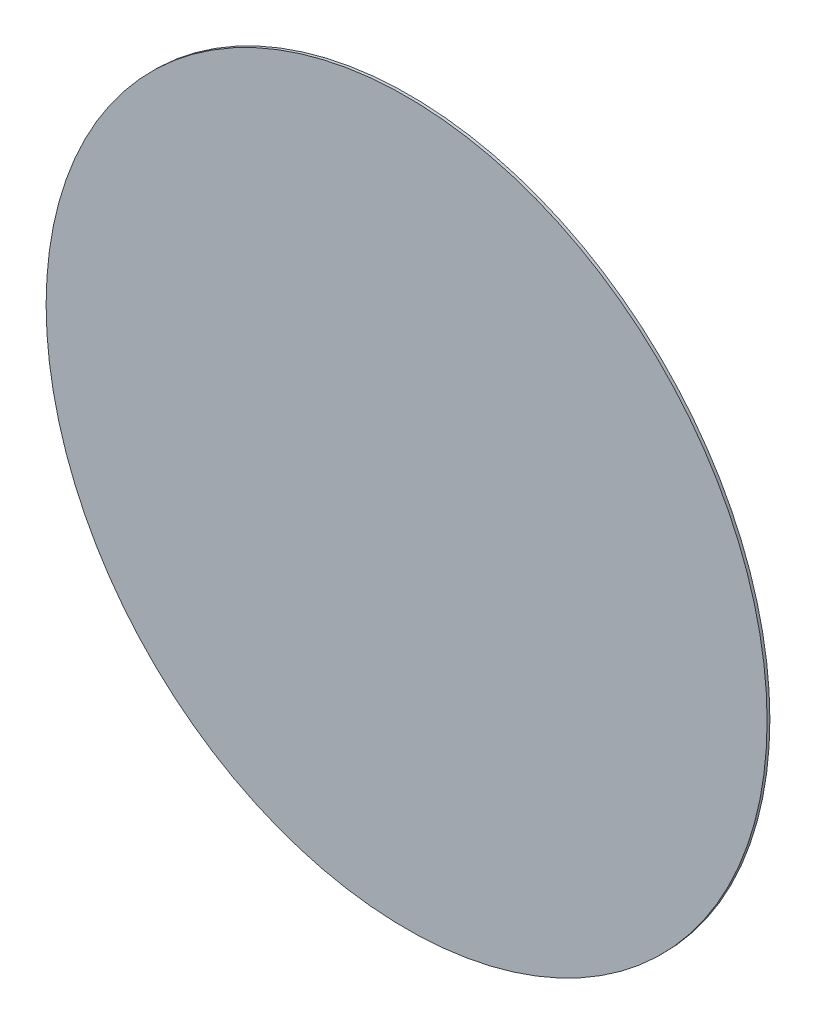
ISO-10303-21;
HEADER;
FILE_DESCRIPTION(('STEP AP214'),'2;1');
FILE_NAME('part.step','',(''),(''),'','','');
FILE_SCHEMA(('AUTOMOTIVE_DESIGN { 1 0 10303 214 1 1 1 1 }'));
ENDSEC;
DATA;
#1=APPLICATION_CONTEXT('core data for automotive mechanical design processes');
#2=APPLICATION_PROTOCOL_DEFINITION('international standard','automotive_design',2000,#1);
#3=PRODUCT_CONTEXT('',#1,'mechanical');
#4=PRODUCT('Part','Part','',(#3));
#5=PRODUCT_RELATED_PRODUCT_CATEGORY('part','',(#4));
#6=PRODUCT_DEFINITION_FORMATION('','',#4);
#7=PRODUCT_DEFINITION_CONTEXT('part definition',#1,'design');
#8=PRODUCT_DEFINITION('design','',#6,#7);
#9=PRODUCT_DEFINITION_SHAPE('','',#8);
#10=(LENGTH_UNIT() NAMED_UNIT(*) SI_UNIT(.MILLI.,.METRE.));
#11=(NAMED_UNIT(*) PLANE_ANGLE_UNIT() SI_UNIT($,.RADIAN.));
#12=(NAMED_UNIT(*) SI_UNIT($,.STERADIAN.) SOLID_ANGLE_UNIT());
#13=UNCERTAINTY_MEASURE_WITH_UNIT(LENGTH_MEASURE(1.E-05),#10,'distance_accuracy_value','');
#14=(GEOMETRIC_REPRESENTATION_CONTEXT(3) GLOBAL_UNCERTAINTY_ASSIGNED_CONTEXT((#13)) GLOBAL_UNIT_ASSIGNED_CONTEXT((#10,
#11,#12)) REPRESENTATION_CONTEXT('',''));
#15=CARTESIAN_POINT('',(0.,0.,0.));
#16=DIRECTION('',(0.,0.,1.));
#17=DIRECTION('',(1.,0.,0.));
#18=AXIS2_PLACEMENT_3D('',#15,#16,#17);
#19=CARTESIAN_POINT('',(0.,0.,0.1));
#20=DIRECTION('',(0.,0.,-1.));
#21=DIRECTION('',(-1.,0.,0.));
#22=AXIS2_PLACEMENT_3D('',#19,#20,#21);
#23=CYLINDRICAL_SURFACE('',#22,13.);
#24=CARTESIAN_POINT('',(0.,0.,0.1));
#25=DIRECTION('',(0.,0.,1.));
#26=DIRECTION('',(1.,0.,0.));
#27=AXIS2_PLACEMENT_3D('',#24,#25,#26);
#28=CIRCLE('',#27,13.);
#29=CARTESIAN_POINT('',(13.,0.,0.1));
#30=VERTEX_POINT('',#29);
#31=EDGE_CURVE('E10',#30,#30,#28,.T.);
#32=ORIENTED_EDGE('',*,*,#31,.F.);
#33=EDGE_LOOP('',(#32));
#34=FACE_BOUND('',#33,.T.);
#35=CARTESIAN_POINT('',(0.,0.,0.));
#36=DIRECTION('',(0.,0.,1.));
#37=DIRECTION('',(1.,0.,0.));
#38=AXIS2_PLACEMENT_3D('',#35,#36,#37);
#39=CIRCLE('',#38,13.);
#40=CARTESIAN_POINT('',(13.,0.,0.));
#41=VERTEX_POINT('',#40);
#42=EDGE_CURVE('E42',#41,#41,#39,.T.);
#43=ORIENTED_EDGE('',*,*,#42,.T.);
#44=EDGE_LOOP('',(#43));
#45=FACE_BOUND('',#44,.T.);
#46=ADVANCED_FACE('F39',(#34,#45),#23,.T.);
#47=CARTESIAN_POINT('',(0.,0.,0.1));
#48=DIRECTION('',(0.,0.,1.));
#49=DIRECTION('',(1.,0.,0.));
#50=AXIS2_PLACEMENT_3D('',#47,#48,#49);
#51=PLANE('',#50);
#52=ORIENTED_EDGE('',*,*,#31,.T.);
#53=EDGE_LOOP('',(#52));
#54=FACE_BOUND('',#53,.T.);
#55=ADVANCED_FACE('F54',(#54),#51,.T.);
#56=CARTESIAN_POINT('',(0.,0.,0.));
#57=DIRECTION('',(0.,0.,1.));
#58=DIRECTION('',(1.,0.,0.));
#59=AXIS2_PLACEMENT_3D('',#56,#57,#58);
#60=PLANE('',#59);
#61=ORIENTED_EDGE('',*,*,#42,.F.);
#62=EDGE_LOOP('',(#61));
#63=FACE_BOUND('',#62,.T.);
#64=ADVANCED_FACE('F52',(#63),#60,.F.);
#65=CLOSED_SHELL('',(#46,#55,#64));
#66=MANIFOLD_SOLID_BREP('B2',#65);
#67=ADVANCED_BREP_SHAPE_REPRESENTATION('',(#18,#66),#14);
#68=SHAPE_DEFINITION_REPRESENTATION(#9,#67);
ENDSEC;
END-ISO-10303-21;
